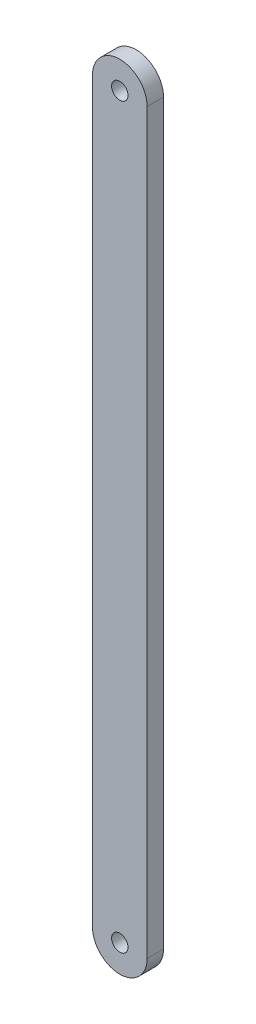
ISO-10303-21;
HEADER;
FILE_DESCRIPTION(('STEP AP214'),'2;1');
FILE_NAME('part.step','',(''),(''),'','','');
FILE_SCHEMA(('AUTOMOTIVE_DESIGN { 1 0 10303 214 1 1 1 1 }'));
ENDSEC;
DATA;
#1=APPLICATION_CONTEXT('core data for automotive mechanical design processes');
#2=APPLICATION_PROTOCOL_DEFINITION('international standard','automotive_design',2000,#1);
#3=PRODUCT_CONTEXT('',#1,'mechanical');
#4=PRODUCT('Part','Part','',(#3));
#5=PRODUCT_RELATED_PRODUCT_CATEGORY('part','',(#4));
#6=PRODUCT_DEFINITION_FORMATION('','',#4);
#7=PRODUCT_DEFINITION_CONTEXT('part definition',#1,'design');
#8=PRODUCT_DEFINITION('design','',#6,#7);
#9=PRODUCT_DEFINITION_SHAPE('','',#8);
#10=(LENGTH_UNIT() NAMED_UNIT(*) SI_UNIT(.MILLI.,.METRE.));
#11=(NAMED_UNIT(*) PLANE_ANGLE_UNIT() SI_UNIT($,.RADIAN.));
#12=(NAMED_UNIT(*) SI_UNIT($,.STERADIAN.) SOLID_ANGLE_UNIT());
#13=UNCERTAINTY_MEASURE_WITH_UNIT(LENGTH_MEASURE(1.E-05),#10,'distance_accuracy_value','');
#14=(GEOMETRIC_REPRESENTATION_CONTEXT(3) GLOBAL_UNCERTAINTY_ASSIGNED_CONTEXT((#13)) GLOBAL_UNIT_ASSIGNED_CONTEXT((#10,
#11,#12)) REPRESENTATION_CONTEXT('',''));
#15=CARTESIAN_POINT('',(0.,0.,0.));
#16=DIRECTION('',(0.,0.,1.));
#17=DIRECTION('',(1.,0.,0.));
#18=AXIS2_PLACEMENT_3D('',#15,#16,#17);
#19=CARTESIAN_POINT('',(0.,0.,6.));
#20=DIRECTION('',(0.,0.,-1.));
#21=DIRECTION('',(-1.,0.,0.));
#22=AXIS2_PLACEMENT_3D('',#19,#20,#21);
#23=CYLINDRICAL_SURFACE('',#22,10.);
#24=CARTESIAN_POINT('',(0.,0.,0.));
#25=DIRECTION('',(0.,0.,1.));
#26=DIRECTION('',(1.,0.,0.));
#27=AXIS2_PLACEMENT_3D('',#24,#25,#26);
#28=CIRCLE('',#27,10.);
#29=CARTESIAN_POINT('',(-10.,0.,0.));
#30=VERTEX_POINT('',#29);
#31=CARTESIAN_POINT('',(10.,0.,0.));
#32=VERTEX_POINT('',#31);
#33=EDGE_CURVE('E96',#30,#32,#28,.T.);
#34=ORIENTED_EDGE('',*,*,#33,.T.);
#35=DIRECTION('',(0.,0.,-1.));
#36=VECTOR('',#35,1.);
#37=CARTESIAN_POINT('',(10.,0.,6.));
#38=LINE('',#37,#36);
#39=CARTESIAN_POINT('',(10.,0.,6.));
#40=VERTEX_POINT('',#39);
#41=EDGE_CURVE('E11',#40,#32,#38,.T.);
#42=ORIENTED_EDGE('',*,*,#41,.F.);
#43=CARTESIAN_POINT('',(0.,0.,6.));
#44=DIRECTION('',(0.,0.,1.));
#45=DIRECTION('',(1.,0.,0.));
#46=AXIS2_PLACEMENT_3D('',#43,#44,#45);
#47=CIRCLE('',#46,10.);
#48=CARTESIAN_POINT('',(-10.,0.,6.));
#49=VERTEX_POINT('',#48);
#50=EDGE_CURVE('E84',#49,#40,#47,.T.);
#51=ORIENTED_EDGE('',*,*,#50,.F.);
#52=DIRECTION('',(0.,0.,-1.));
#53=VECTOR('',#52,1.);
#54=CARTESIAN_POINT('',(-10.,0.,6.));
#55=LINE('',#54,#53);
#56=EDGE_CURVE('E92',#49,#30,#55,.T.);
#57=ORIENTED_EDGE('',*,*,#56,.T.);
#58=EDGE_LOOP('',(#34,#42,#51,#57));
#59=FACE_BOUND('',#58,.T.);
#60=ADVANCED_FACE('F33',(#59),#23,.T.);
#61=CARTESIAN_POINT('',(10.,0.,6.));
#62=DIRECTION('',(-1.,0.,0.));
#63=DIRECTION('',(0.,0.,1.));
#64=AXIS2_PLACEMENT_3D('',#61,#62,#63);
#65=PLANE('',#64);
#66=DIRECTION('',(0.,1.,0.));
#67=VECTOR('',#66,1.);
#68=CARTESIAN_POINT('',(10.,0.,0.));
#69=LINE('',#68,#67);
#70=CARTESIAN_POINT('',(10.,270.,0.));
#71=VERTEX_POINT('',#70);
#72=EDGE_CURVE('E88',#32,#71,#69,.T.);
#73=ORIENTED_EDGE('',*,*,#72,.T.);
#74=DIRECTION('',(0.,0.,-1.));
#75=VECTOR('',#74,1.);
#76=CARTESIAN_POINT('',(10.,270.,6.));
#77=LINE('',#76,#75);
#78=CARTESIAN_POINT('',(10.,270.,6.));
#79=VERTEX_POINT('',#78);
#80=EDGE_CURVE('E41',#79,#71,#77,.T.);
#81=ORIENTED_EDGE('',*,*,#80,.F.);
#82=DIRECTION('',(0.,1.,0.));
#83=VECTOR('',#82,1.);
#84=CARTESIAN_POINT('',(10.,0.,6.));
#85=LINE('',#84,#83);
#86=EDGE_CURVE('E79',#40,#79,#85,.T.);
#87=ORIENTED_EDGE('',*,*,#86,.F.);
#88=ORIENTED_EDGE('',*,*,#41,.T.);
#89=EDGE_LOOP('',(#73,#81,#87,#88));
#90=FACE_BOUND('',#89,.T.);
#91=ADVANCED_FACE('F87',(#90),#65,.F.);
#92=CARTESIAN_POINT('',(0.,270.,6.));
#93=DIRECTION('',(0.,0.,-1.));
#94=DIRECTION('',(-1.,0.,0.));
#95=AXIS2_PLACEMENT_3D('',#92,#93,#94);
#96=CYLINDRICAL_SURFACE('',#95,10.);
#97=CARTESIAN_POINT('',(0.,270.,0.));
#98=DIRECTION('',(0.,0.,1.));
#99=DIRECTION('',(1.,0.,0.));
#100=AXIS2_PLACEMENT_3D('',#97,#98,#99);
#101=CIRCLE('',#100,10.);
#102=CARTESIAN_POINT('',(-10.,270.,0.));
#103=VERTEX_POINT('',#102);
#104=EDGE_CURVE('E66',#71,#103,#101,.T.);
#105=ORIENTED_EDGE('',*,*,#104,.T.);
#106=DIRECTION('',(0.,0.,-1.));
#107=VECTOR('',#106,1.);
#108=CARTESIAN_POINT('',(-10.,270.,6.));
#109=LINE('',#108,#107);
#110=CARTESIAN_POINT('',(-10.,270.,6.));
#111=VERTEX_POINT('',#110);
#112=EDGE_CURVE('E89',#111,#103,#109,.T.);
#113=ORIENTED_EDGE('',*,*,#112,.F.);
#114=CARTESIAN_POINT('',(0.,270.,6.));
#115=DIRECTION('',(0.,0.,1.));
#116=DIRECTION('',(1.,0.,0.));
#117=AXIS2_PLACEMENT_3D('',#114,#115,#116);
#118=CIRCLE('',#117,10.);
#119=EDGE_CURVE('E82',#79,#111,#118,.T.);
#120=ORIENTED_EDGE('',*,*,#119,.F.);
#121=ORIENTED_EDGE('',*,*,#80,.T.);
#122=EDGE_LOOP('',(#105,#113,#120,#121));
#123=FACE_BOUND('',#122,.T.);
#124=ADVANCED_FACE('F90',(#123),#96,.T.);
#125=CARTESIAN_POINT('',(-10.,0.,6.));
#126=DIRECTION('',(1.,0.,0.));
#127=DIRECTION('',(0.,0.,-1.));
#128=AXIS2_PLACEMENT_3D('',#125,#126,#127);
#129=PLANE('',#128);
#130=DIRECTION('',(0.,-1.,0.));
#131=VECTOR('',#130,1.);
#132=CARTESIAN_POINT('',(-10.,0.,0.));
#133=LINE('',#132,#131);
#134=EDGE_CURVE('E72',#103,#30,#133,.T.);
#135=ORIENTED_EDGE('',*,*,#134,.T.);
#136=ORIENTED_EDGE('',*,*,#56,.F.);
#137=DIRECTION('',(0.,-1.,0.));
#138=VECTOR('',#137,1.);
#139=CARTESIAN_POINT('',(-10.,0.,6.));
#140=LINE('',#139,#138);
#141=EDGE_CURVE('E49',#111,#49,#140,.T.);
#142=ORIENTED_EDGE('',*,*,#141,.F.);
#143=ORIENTED_EDGE('',*,*,#112,.T.);
#144=EDGE_LOOP('',(#135,#136,#142,#143));
#145=FACE_BOUND('',#144,.T.);
#146=ADVANCED_FACE('F104',(#145),#129,.F.);
#147=CARTESIAN_POINT('',(0.,0.,6.));
#148=DIRECTION('',(0.,0.,1.));
#149=DIRECTION('',(1.,0.,0.));
#150=AXIS2_PLACEMENT_3D('',#147,#148,#149);
#151=PLANE('',#150);
#152=CARTESIAN_POINT('',(0.,0.,6.));
#153=DIRECTION('',(0.,0.,1.));
#154=DIRECTION('',(1.,0.,0.));
#155=AXIS2_PLACEMENT_3D('',#152,#153,#154);
#156=CIRCLE('',#155,3.);
#157=CARTESIAN_POINT('',(3.,0.,6.));
#158=VERTEX_POINT('',#157);
#159=EDGE_CURVE('E116',#158,#158,#156,.T.);
#160=ORIENTED_EDGE('',*,*,#159,.F.);
#161=EDGE_LOOP('',(#160));
#162=FACE_BOUND('',#161,.T.);
#163=CARTESIAN_POINT('',(0.,270.,6.));
#164=DIRECTION('',(0.,0.,1.));
#165=DIRECTION('',(1.,0.,0.));
#166=AXIS2_PLACEMENT_3D('',#163,#164,#165);
#167=CIRCLE('',#166,3.);
#168=CARTESIAN_POINT('',(3.,270.,6.));
#169=VERTEX_POINT('',#168);
#170=EDGE_CURVE('E110',#169,#169,#167,.T.);
#171=ORIENTED_EDGE('',*,*,#170,.F.);
#172=EDGE_LOOP('',(#171));
#173=FACE_BOUND('',#172,.T.);
#174=ORIENTED_EDGE('',*,*,#50,.T.);
#175=ORIENTED_EDGE('',*,*,#86,.T.);
#176=ORIENTED_EDGE('',*,*,#119,.T.);
#177=ORIENTED_EDGE('',*,*,#141,.T.);
#178=EDGE_LOOP('',(#174,#175,#176,#177));
#179=FACE_BOUND('',#178,.T.);
#180=ADVANCED_FACE('F80',(#162,#173,#179),#151,.T.);
#181=CARTESIAN_POINT('',(0.,0.,0.));
#182=DIRECTION('',(0.,0.,1.));
#183=DIRECTION('',(1.,0.,0.));
#184=AXIS2_PLACEMENT_3D('',#181,#182,#183);
#185=PLANE('',#184);
#186=CARTESIAN_POINT('',(0.,0.,0.));
#187=DIRECTION('',(0.,0.,1.));
#188=DIRECTION('',(1.,0.,0.));
#189=AXIS2_PLACEMENT_3D('',#186,#187,#188);
#190=CIRCLE('',#189,3.);
#191=CARTESIAN_POINT('',(3.,0.,0.));
#192=VERTEX_POINT('',#191);
#193=EDGE_CURVE('E113',#192,#192,#190,.T.);
#194=ORIENTED_EDGE('',*,*,#193,.T.);
#195=EDGE_LOOP('',(#194));
#196=FACE_BOUND('',#195,.T.);
#197=CARTESIAN_POINT('',(0.,270.,0.));
#198=DIRECTION('',(0.,0.,1.));
#199=DIRECTION('',(1.,0.,0.));
#200=AXIS2_PLACEMENT_3D('',#197,#198,#199);
#201=CIRCLE('',#200,3.);
#202=CARTESIAN_POINT('',(3.,270.,0.));
#203=VERTEX_POINT('',#202);
#204=EDGE_CURVE('E99',#203,#203,#201,.T.);
#205=ORIENTED_EDGE('',*,*,#204,.T.);
#206=EDGE_LOOP('',(#205));
#207=FACE_BOUND('',#206,.T.);
#208=ORIENTED_EDGE('',*,*,#33,.F.);
#209=ORIENTED_EDGE('',*,*,#134,.F.);
#210=ORIENTED_EDGE('',*,*,#104,.F.);
#211=ORIENTED_EDGE('',*,*,#72,.F.);
#212=EDGE_LOOP('',(#208,#209,#210,#211));
#213=FACE_BOUND('',#212,.T.);
#214=ADVANCED_FACE('F107',(#196,#207,#213),#185,.F.);
#215=CARTESIAN_POINT('',(0.,270.,0.));
#216=DIRECTION('',(0.,0.,1.));
#217=DIRECTION('',(1.,0.,0.));
#218=AXIS2_PLACEMENT_3D('',#215,#216,#217);
#219=CYLINDRICAL_SURFACE('',#218,3.);
#220=ORIENTED_EDGE('',*,*,#204,.F.);
#221=EDGE_LOOP('',(#220));
#222=FACE_BOUND('',#221,.T.);
#223=ORIENTED_EDGE('',*,*,#170,.T.);
#224=EDGE_LOOP('',(#223));
#225=FACE_BOUND('',#224,.T.);
#226=ADVANCED_FACE('F127',(#222,#225),#219,.F.);
#227=CARTESIAN_POINT('',(0.,0.,0.));
#228=DIRECTION('',(0.,0.,1.));
#229=DIRECTION('',(1.,0.,0.));
#230=AXIS2_PLACEMENT_3D('',#227,#228,#229);
#231=CYLINDRICAL_SURFACE('',#230,3.);
#232=ORIENTED_EDGE('',*,*,#193,.F.);
#233=EDGE_LOOP('',(#232));
#234=FACE_BOUND('',#233,.T.);
#235=ORIENTED_EDGE('',*,*,#159,.T.);
#236=EDGE_LOOP('',(#235));
#237=FACE_BOUND('',#236,.T.);
#238=ADVANCED_FACE('F124',(#234,#237),#231,.F.);
#239=CLOSED_SHELL('',(#60,#91,#124,#146,#180,#214,#226,#238));
#240=MANIFOLD_SOLID_BREP('B2',#239);
#241=ADVANCED_BREP_SHAPE_REPRESENTATION('',(#18,#240),#14);
#242=SHAPE_DEFINITION_REPRESENTATION(#9,#241);
ENDSEC;
END-ISO-10303-21;
